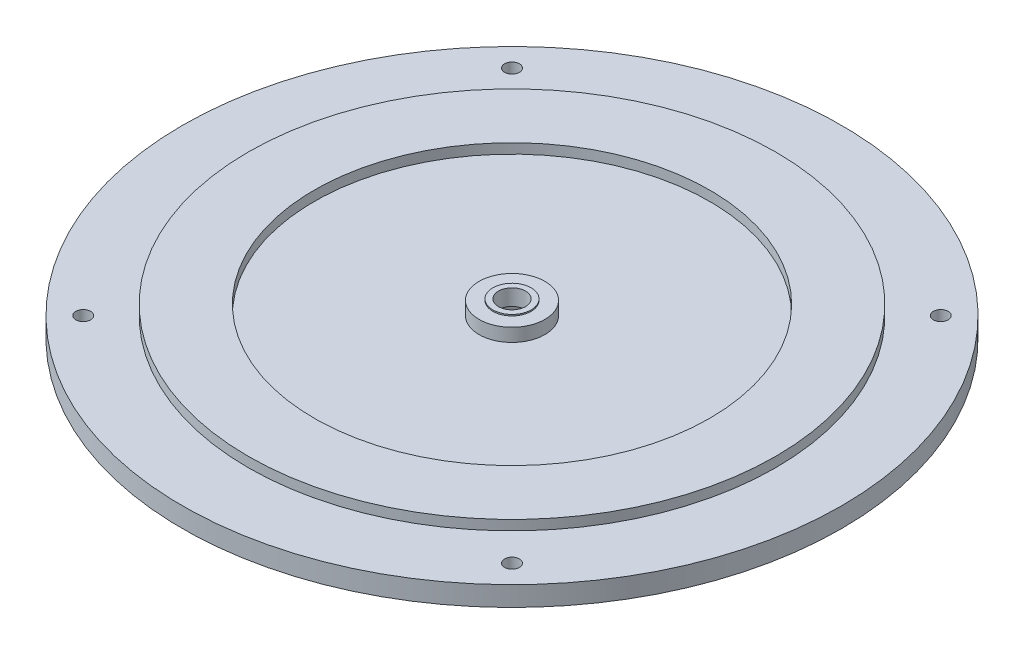
ISO-10303-21;
HEADER;
FILE_DESCRIPTION(('STEP AP214'),'2;1');
FILE_NAME('part.step','',(''),(''),'','','');
FILE_SCHEMA(('AUTOMOTIVE_DESIGN { 1 0 10303 214 1 1 1 1 }'));
ENDSEC;
DATA;
#1=APPLICATION_CONTEXT('core data for automotive mechanical design processes');
#2=APPLICATION_PROTOCOL_DEFINITION('international standard','automotive_design',2000,#1);
#3=PRODUCT_CONTEXT('',#1,'mechanical');
#4=PRODUCT('Part','Part','',(#3));
#5=PRODUCT_RELATED_PRODUCT_CATEGORY('part','',(#4));
#6=PRODUCT_DEFINITION_FORMATION('','',#4);
#7=PRODUCT_DEFINITION_CONTEXT('part definition',#1,'design');
#8=PRODUCT_DEFINITION('design','',#6,#7);
#9=PRODUCT_DEFINITION_SHAPE('','',#8);
#10=(LENGTH_UNIT() NAMED_UNIT(*) SI_UNIT(.MILLI.,.METRE.));
#11=(NAMED_UNIT(*) PLANE_ANGLE_UNIT() SI_UNIT($,.RADIAN.));
#12=(NAMED_UNIT(*) SI_UNIT($,.STERADIAN.) SOLID_ANGLE_UNIT());
#13=UNCERTAINTY_MEASURE_WITH_UNIT(LENGTH_MEASURE(1.E-05),#10,'distance_accuracy_value','');
#14=(GEOMETRIC_REPRESENTATION_CONTEXT(3) GLOBAL_UNCERTAINTY_ASSIGNED_CONTEXT((#13)) GLOBAL_UNIT_ASSIGNED_CONTEXT((#10,
#11,#12)) REPRESENTATION_CONTEXT('',''));
#15=CARTESIAN_POINT('',(0.,0.,0.));
#16=DIRECTION('',(0.,0.,1.));
#17=DIRECTION('',(1.,0.,0.));
#18=AXIS2_PLACEMENT_3D('',#15,#16,#17);
#19=CARTESIAN_POINT('',(85.,-0.5,-85.));
#20=DIRECTION('',(0.,1.,0.));
#21=DIRECTION('',(0.,0.,-1.));
#22=AXIS2_PLACEMENT_3D('',#19,#20,#21);
#23=PLANE('',#22);
#24=CARTESIAN_POINT('',(85.,-0.5,-85.));
#25=DIRECTION('',(0.,1.,0.));
#26=DIRECTION('',(1.,0.,0.));
#27=AXIS2_PLACEMENT_3D('',#24,#25,#26);
#28=CIRCLE('',#27,5.8);
#29=CARTESIAN_POINT('',(90.8,-0.5,-85.));
#30=VERTEX_POINT('',#29);
#31=EDGE_CURVE('E24',#30,#30,#28,.T.);
#32=ORIENTED_EDGE('',*,*,#31,.F.);
#33=EDGE_LOOP('',(#32));
#34=FACE_BOUND('',#33,.T.);
#35=CARTESIAN_POINT('',(85.,-0.5,-85.));
#36=DIRECTION('',(0.,1.,0.));
#37=DIRECTION('',(1.,0.,0.));
#38=AXIS2_PLACEMENT_3D('',#35,#36,#37);
#39=CIRCLE('',#38,10.);
#40=CARTESIAN_POINT('',(95.,-0.5,-85.));
#41=VERTEX_POINT('',#40);
#42=EDGE_CURVE('E41',#41,#41,#39,.T.);
#43=ORIENTED_EDGE('',*,*,#42,.T.);
#44=EDGE_LOOP('',(#43));
#45=FACE_BOUND('',#44,.T.);
#46=ADVANCED_FACE('F16',(#34,#45),#23,.T.);
#47=CARTESIAN_POINT('',(85.,-0.5,-85.));
#48=DIRECTION('',(0.,-1.,0.));
#49=DIRECTION('',(1.,0.,0.));
#50=AXIS2_PLACEMENT_3D('',#47,#48,#49);
#51=CYLINDRICAL_SURFACE('',#50,5.8);
#52=ORIENTED_EDGE('',*,*,#31,.T.);
#53=DIRECTION('',(0.,1.,0.));
#54=VECTOR('',#53,1.);
#55=CARTESIAN_POINT('',(90.8,-0.5,-85.));
#56=LINE('',#55,#54);
#57=CARTESIAN_POINT('',(90.8,-0.1,-85.));
#58=VERTEX_POINT('',#57);
#59=EDGE_CURVE('E10',#30,#58,#56,.T.);
#60=ORIENTED_EDGE('',*,*,#59,.T.);
#61=CARTESIAN_POINT('',(85.,-0.1,-85.));
#62=DIRECTION('',(0.,1.,0.));
#63=DIRECTION('',(1.,0.,0.));
#64=AXIS2_PLACEMENT_3D('',#61,#62,#63);
#65=CIRCLE('',#64,5.8);
#66=EDGE_CURVE('E166',#58,#58,#65,.T.);
#67=ORIENTED_EDGE('',*,*,#66,.F.);
#68=ORIENTED_EDGE('',*,*,#59,.F.);
#69=EDGE_LOOP('',(#52,#60,#67,#68));
#70=FACE_BOUND('',#69,.T.);
#71=ADVANCED_FACE('F182',(#70),#51,.T.);
#72=CARTESIAN_POINT('',(85.,-4.5,-85.));
#73=DIRECTION('',(0.,-1.,0.));
#74=DIRECTION('',(1.,0.,0.));
#75=AXIS2_PLACEMENT_3D('',#72,#73,#74);
#76=CYLINDRICAL_SURFACE('',#75,10.);
#77=CARTESIAN_POINT('',(85.,-4.5,-85.));
#78=DIRECTION('',(0.,1.,0.));
#79=DIRECTION('',(1.,0.,0.));
#80=AXIS2_PLACEMENT_3D('',#77,#78,#79);
#81=CIRCLE('',#80,10.);
#82=CARTESIAN_POINT('',(95.,-4.5,-85.));
#83=VERTEX_POINT('',#82);
#84=EDGE_CURVE('E170',#83,#83,#81,.T.);
#85=ORIENTED_EDGE('',*,*,#84,.T.);
#86=DIRECTION('',(0.,1.,0.));
#87=VECTOR('',#86,1.);
#88=CARTESIAN_POINT('',(95.,-4.5,-85.));
#89=LINE('',#88,#87);
#90=EDGE_CURVE('E163',#83,#41,#89,.T.);
#91=ORIENTED_EDGE('',*,*,#90,.T.);
#92=ORIENTED_EDGE('',*,*,#42,.F.);
#93=ORIENTED_EDGE('',*,*,#90,.F.);
#94=EDGE_LOOP('',(#85,#91,#92,#93));
#95=FACE_BOUND('',#94,.T.);
#96=ADVANCED_FACE('F164',(#95),#76,.T.);
#97=CARTESIAN_POINT('',(85.,-0.1,-85.));
#98=DIRECTION('',(0.,1.,0.));
#99=DIRECTION('',(0.,0.,-1.));
#100=AXIS2_PLACEMENT_3D('',#97,#98,#99);
#101=PLANE('',#100);
#102=CARTESIAN_POINT('',(85.,-0.1,-85.));
#103=DIRECTION('',(0.,-1.,0.));
#104=DIRECTION('',(1.,0.,0.));
#105=AXIS2_PLACEMENT_3D('',#102,#103,#104);
#106=CIRCLE('',#105,4.1);
#107=CARTESIAN_POINT('',(89.1,-0.1,-85.));
#108=VERTEX_POINT('',#107);
#109=EDGE_CURVE('E395',#108,#108,#106,.T.);
#110=ORIENTED_EDGE('',*,*,#109,.T.);
#111=EDGE_LOOP('',(#110));
#112=FACE_BOUND('',#111,.T.);
#113=ORIENTED_EDGE('',*,*,#66,.T.);
#114=EDGE_LOOP('',(#113));
#115=FACE_BOUND('',#114,.T.);
#116=ADVANCED_FACE('F192',(#112,#115),#101,.T.);
#117=CARTESIAN_POINT('',(85.,-4.5,-85.));
#118=DIRECTION('',(0.,1.,0.));
#119=DIRECTION('',(0.,0.,-1.));
#120=AXIS2_PLACEMENT_3D('',#117,#118,#119);
#121=PLANE('',#120);
#122=ORIENTED_EDGE('',*,*,#84,.F.);
#123=EDGE_LOOP('',(#122));
#124=FACE_BOUND('',#123,.T.);
#125=CARTESIAN_POINT('',(85.,-4.5,-85.));
#126=DIRECTION('',(0.,1.,0.));
#127=DIRECTION('',(1.,0.,0.));
#128=AXIS2_PLACEMENT_3D('',#125,#126,#127);
#129=CIRCLE('',#128,60.);
#130=CARTESIAN_POINT('',(145.,-4.5,-85.));
#131=VERTEX_POINT('',#130);
#132=EDGE_CURVE('E396',#131,#131,#129,.T.);
#133=ORIENTED_EDGE('',*,*,#132,.T.);
#134=EDGE_LOOP('',(#133));
#135=FACE_BOUND('',#134,.T.);
#136=ADVANCED_FACE('F200',(#124,#135),#121,.T.);
#137=CARTESIAN_POINT('',(85.,-10.5,-85.));
#138=DIRECTION('',(0.,-1.,0.));
#139=DIRECTION('',(1.,0.,0.));
#140=AXIS2_PLACEMENT_3D('',#137,#138,#139);
#141=CYLINDRICAL_SURFACE('',#140,4.1);
#142=CARTESIAN_POINT('',(85.,-5.,-85.));
#143=DIRECTION('',(0.,-1.,0.));
#144=DIRECTION('',(1.,0.,0.));
#145=AXIS2_PLACEMENT_3D('',#142,#143,#144);
#146=CIRCLE('',#145,4.1);
#147=CARTESIAN_POINT('',(89.1,-5.,-85.));
#148=VERTEX_POINT('',#147);
#149=EDGE_CURVE('E421',#148,#148,#146,.T.);
#150=ORIENTED_EDGE('',*,*,#149,.T.);
#151=DIRECTION('',(0.,1.,0.));
#152=VECTOR('',#151,1.);
#153=CARTESIAN_POINT('',(89.1,-10.5,-85.));
#154=LINE('',#153,#152);
#155=EDGE_CURVE('E391',#148,#108,#154,.T.);
#156=ORIENTED_EDGE('',*,*,#155,.T.);
#157=ORIENTED_EDGE('',*,*,#109,.F.);
#158=ORIENTED_EDGE('',*,*,#155,.F.);
#159=EDGE_LOOP('',(#150,#156,#157,#158));
#160=FACE_BOUND('',#159,.T.);
#161=ADVANCED_FACE('F201',(#160),#141,.F.);
#162=CARTESIAN_POINT('',(85.,-4.5,-85.));
#163=DIRECTION('',(0.,-1.,0.));
#164=DIRECTION('',(1.,0.,0.));
#165=AXIS2_PLACEMENT_3D('',#162,#163,#164);
#166=CYLINDRICAL_SURFACE('',#165,60.);
#167=DIRECTION('',(0.,1.,0.));
#168=VECTOR('',#167,1.);
#169=CARTESIAN_POINT('',(145.,-4.5,-85.));
#170=LINE('',#169,#168);
#171=CARTESIAN_POINT('',(145.,-1.5,-85.));
#172=VERTEX_POINT('',#171);
#173=EDGE_CURVE('E430',#131,#172,#170,.T.);
#174=ORIENTED_EDGE('',*,*,#173,.T.);
#175=CARTESIAN_POINT('',(85.,-1.5,-85.));
#176=DIRECTION('',(0.,1.,0.));
#177=DIRECTION('',(1.,0.,0.));
#178=AXIS2_PLACEMENT_3D('',#175,#176,#177);
#179=CIRCLE('',#178,60.);
#180=EDGE_CURVE('E425',#172,#172,#179,.T.);
#181=ORIENTED_EDGE('',*,*,#180,.T.);
#182=ORIENTED_EDGE('',*,*,#173,.F.);
#183=ORIENTED_EDGE('',*,*,#132,.F.);
#184=EDGE_LOOP('',(#174,#181,#182,#183));
#185=FACE_BOUND('',#184,.T.);
#186=ADVANCED_FACE('F210',(#185),#166,.F.);
#187=CARTESIAN_POINT('',(85.,-5.,-85.));
#188=DIRECTION('',(0.,1.,0.));
#189=DIRECTION('',(0.,0.,-1.));
#190=AXIS2_PLACEMENT_3D('',#187,#188,#189);
#191=PLANE('',#190);
#192=ORIENTED_EDGE('',*,*,#149,.F.);
#193=EDGE_LOOP('',(#192));
#194=FACE_BOUND('',#193,.T.);
#195=DIRECTION('',(0.50000000000019,0.,-0.866025403784329));
#196=VECTOR('',#195,1.);
#197=CARTESIAN_POINT('',(88.810511776652,-5.,-78.4));
#198=LINE('',#197,#196);
#199=CARTESIAN_POINT('',(88.810511776652,-5.,-78.4));
#200=VERTEX_POINT('',#199);
#201=CARTESIAN_POINT('',(92.621023553303,-5.,-85.));
#202=VERTEX_POINT('',#201);
#203=EDGE_CURVE('E390',#200,#202,#198,.T.);
#204=ORIENTED_EDGE('',*,*,#203,.F.);
#205=DIRECTION('',(1.,0.,0.));
#206=VECTOR('',#205,1.);
#207=CARTESIAN_POINT('',(81.189488223348,-5.,-78.4));
#208=LINE('',#207,#206);
#209=CARTESIAN_POINT('',(81.189488223348,-5.,-78.4));
#210=VERTEX_POINT('',#209);
#211=EDGE_CURVE('E407',#210,#200,#208,.T.);
#212=ORIENTED_EDGE('',*,*,#211,.F.);
#213=DIRECTION('',(0.50000000000019,0.,0.866025403784329));
#214=VECTOR('',#213,1.);
#215=CARTESIAN_POINT('',(77.378976446697,-5.,-85.));
#216=LINE('',#215,#214);
#217=CARTESIAN_POINT('',(77.378976446697,-5.,-85.));
#218=VERTEX_POINT('',#217);
#219=EDGE_CURVE('E420',#218,#210,#216,.T.);
#220=ORIENTED_EDGE('',*,*,#219,.F.);
#221=DIRECTION('',(-0.50000000000019,0.,0.866025403784329));
#222=VECTOR('',#221,1.);
#223=CARTESIAN_POINT('',(81.189488223348,-5.,-91.6));
#224=LINE('',#223,#222);
#225=CARTESIAN_POINT('',(81.189488223348,-5.,-91.6));
#226=VERTEX_POINT('',#225);
#227=EDGE_CURVE('E411',#226,#218,#224,.T.);
#228=ORIENTED_EDGE('',*,*,#227,.F.);
#229=DIRECTION('',(-1.,0.,0.));
#230=VECTOR('',#229,1.);
#231=CARTESIAN_POINT('',(88.810511776652,-5.,-91.6));
#232=LINE('',#231,#230);
#233=CARTESIAN_POINT('',(88.810511776652,-5.,-91.6));
#234=VERTEX_POINT('',#233);
#235=EDGE_CURVE('E388',#234,#226,#232,.T.);
#236=ORIENTED_EDGE('',*,*,#235,.F.);
#237=DIRECTION('',(-0.50000000000019,0.,-0.866025403784329));
#238=VECTOR('',#237,1.);
#239=CARTESIAN_POINT('',(92.621023553303,-5.,-85.));
#240=LINE('',#239,#238);
#241=EDGE_CURVE('E377',#202,#234,#240,.T.);
#242=ORIENTED_EDGE('',*,*,#241,.F.);
#243=EDGE_LOOP('',(#204,#212,#220,#228,#236,#242));
#244=FACE_BOUND('',#243,.T.);
#245=ADVANCED_FACE('F211',(#194,#244),#191,.F.);
#246=CARTESIAN_POINT('',(85.,-1.5,-85.));
#247=DIRECTION('',(0.,1.,0.));
#248=DIRECTION('',(0.,0.,-1.));
#249=AXIS2_PLACEMENT_3D('',#246,#247,#248);
#250=PLANE('',#249);
#251=ORIENTED_EDGE('',*,*,#180,.F.);
#252=EDGE_LOOP('',(#251));
#253=FACE_BOUND('',#252,.T.);
#254=CARTESIAN_POINT('',(85.,-1.5,-85.));
#255=DIRECTION('',(0.,1.,0.));
#256=DIRECTION('',(1.,0.,0.));
#257=AXIS2_PLACEMENT_3D('',#254,#255,#256);
#258=CIRCLE('',#257,80.);
#259=CARTESIAN_POINT('',(165.,-1.5,-85.));
#260=VERTEX_POINT('',#259);
#261=EDGE_CURVE('E369',#260,#260,#258,.T.);
#262=ORIENTED_EDGE('',*,*,#261,.T.);
#263=EDGE_LOOP('',(#262));
#264=FACE_BOUND('',#263,.T.);
#265=ADVANCED_FACE('F214',(#253,#264),#250,.T.);
#266=CARTESIAN_POINT('',(77.378976446697,-10.5,-85.));
#267=DIRECTION('',(0.866025403784329,0.,-0.50000000000019));
#268=DIRECTION('',(0.,-1.,0.));
#269=AXIS2_PLACEMENT_3D('',#266,#267,#268);
#270=PLANE('',#269);
#271=DIRECTION('',(0.,1.,0.));
#272=VECTOR('',#271,1.);
#273=CARTESIAN_POINT('',(77.378976446697,-10.5,-85.));
#274=LINE('',#273,#272);
#275=CARTESIAN_POINT('',(77.378976446697,-10.5,-85.));
#276=VERTEX_POINT('',#275);
#277=EDGE_CURVE('E414',#276,#218,#274,.T.);
#278=ORIENTED_EDGE('',*,*,#277,.T.);
#279=ORIENTED_EDGE('',*,*,#219,.T.);
#280=DIRECTION('',(0.,1.,0.));
#281=VECTOR('',#280,1.);
#282=CARTESIAN_POINT('',(81.189488223348,-10.5,-78.4));
#283=LINE('',#282,#281);
#284=CARTESIAN_POINT('',(81.189488223348,-10.5,-78.4));
#285=VERTEX_POINT('',#284);
#286=EDGE_CURVE('E402',#285,#210,#283,.T.);
#287=ORIENTED_EDGE('',*,*,#286,.F.);
#288=DIRECTION('',(0.50000000000019,0.,0.866025403784329));
#289=VECTOR('',#288,1.);
#290=CARTESIAN_POINT('',(77.378976446697,-10.5,-85.));
#291=LINE('',#290,#289);
#292=EDGE_CURVE('E298',#276,#285,#291,.T.);
#293=ORIENTED_EDGE('',*,*,#292,.F.);
#294=EDGE_LOOP('',(#278,#279,#287,#293));
#295=FACE_BOUND('',#294,.T.);
#296=ADVANCED_FACE('F241',(#295),#270,.T.);
#297=CARTESIAN_POINT('',(81.189488223348,-10.5,-91.6));
#298=DIRECTION('',(0.866025403784329,0.,0.50000000000019));
#299=DIRECTION('',(0.,-1.,0.));
#300=AXIS2_PLACEMENT_3D('',#297,#298,#299);
#301=PLANE('',#300);
#302=DIRECTION('',(0.,1.,0.));
#303=VECTOR('',#302,1.);
#304=CARTESIAN_POINT('',(81.189488223348,-10.5,-91.6));
#305=LINE('',#304,#303);
#306=CARTESIAN_POINT('',(81.189488223348,-10.5,-91.6));
#307=VERTEX_POINT('',#306);
#308=EDGE_CURVE('E399',#307,#226,#305,.T.);
#309=ORIENTED_EDGE('',*,*,#308,.T.);
#310=ORIENTED_EDGE('',*,*,#227,.T.);
#311=ORIENTED_EDGE('',*,*,#277,.F.);
#312=DIRECTION('',(-0.50000000000019,0.,0.866025403784329));
#313=VECTOR('',#312,1.);
#314=CARTESIAN_POINT('',(81.189488223348,-10.5,-91.6));
#315=LINE('',#314,#313);
#316=EDGE_CURVE('E332',#307,#276,#315,.T.);
#317=ORIENTED_EDGE('',*,*,#316,.F.);
#318=EDGE_LOOP('',(#309,#310,#311,#317));
#319=FACE_BOUND('',#318,.T.);
#320=ADVANCED_FACE('F222',(#319),#301,.T.);
#321=CARTESIAN_POINT('',(81.189488223348,-10.5,-78.4));
#322=DIRECTION('',(0.,0.,-1.));
#323=DIRECTION('',(0.,-1.,0.));
#324=AXIS2_PLACEMENT_3D('',#321,#322,#323);
#325=PLANE('',#324);
#326=ORIENTED_EDGE('',*,*,#286,.T.);
#327=ORIENTED_EDGE('',*,*,#211,.T.);
#328=DIRECTION('',(0.,1.,0.));
#329=VECTOR('',#328,1.);
#330=CARTESIAN_POINT('',(88.810511776652,-10.5,-78.4));
#331=LINE('',#330,#329);
#332=CARTESIAN_POINT('',(88.810511776652,-10.5,-78.4));
#333=VERTEX_POINT('',#332);
#334=EDGE_CURVE('E295',#333,#200,#331,.T.);
#335=ORIENTED_EDGE('',*,*,#334,.F.);
#336=DIRECTION('',(1.,0.,0.));
#337=VECTOR('',#336,1.);
#338=CARTESIAN_POINT('',(81.189488223348,-10.5,-78.4));
#339=LINE('',#338,#337);
#340=EDGE_CURVE('E292',#285,#333,#339,.T.);
#341=ORIENTED_EDGE('',*,*,#340,.F.);
#342=EDGE_LOOP('',(#326,#327,#335,#341));
#343=FACE_BOUND('',#342,.T.);
#344=ADVANCED_FACE('F220',(#343),#325,.T.);
#345=CARTESIAN_POINT('',(88.810511776652,-10.5,-91.6));
#346=DIRECTION('',(0.,0.,1.));
#347=DIRECTION('',(1.,0.,0.));
#348=AXIS2_PLACEMENT_3D('',#345,#346,#347);
#349=PLANE('',#348);
#350=DIRECTION('',(0.,1.,0.));
#351=VECTOR('',#350,1.);
#352=CARTESIAN_POINT('',(88.810511776652,-10.5,-91.6));
#353=LINE('',#352,#351);
#354=CARTESIAN_POINT('',(88.810511776652,-10.5,-91.6));
#355=VERTEX_POINT('',#354);
#356=EDGE_CURVE('E382',#355,#234,#353,.T.);
#357=ORIENTED_EDGE('',*,*,#356,.T.);
#358=ORIENTED_EDGE('',*,*,#235,.T.);
#359=ORIENTED_EDGE('',*,*,#308,.F.);
#360=DIRECTION('',(-1.,0.,0.));
#361=VECTOR('',#360,1.);
#362=CARTESIAN_POINT('',(88.810511776652,-10.5,-91.6));
#363=LINE('',#362,#361);
#364=EDGE_CURVE('E336',#355,#307,#363,.T.);
#365=ORIENTED_EDGE('',*,*,#364,.F.);
#366=EDGE_LOOP('',(#357,#358,#359,#365));
#367=FACE_BOUND('',#366,.T.);
#368=ADVANCED_FACE('F219',(#367),#349,.T.);
#369=CARTESIAN_POINT('',(88.810511776652,-10.5,-78.4));
#370=DIRECTION('',(-0.866025403784329,0.,-0.50000000000019));
#371=DIRECTION('',(-0.50000000000019,0.,0.866025403784329));
#372=AXIS2_PLACEMENT_3D('',#369,#370,#371);
#373=PLANE('',#372);
#374=ORIENTED_EDGE('',*,*,#334,.T.);
#375=ORIENTED_EDGE('',*,*,#203,.T.);
#376=DIRECTION('',(0.,1.,0.));
#377=VECTOR('',#376,1.);
#378=CARTESIAN_POINT('',(92.621023553303,-10.5,-85.));
#379=LINE('',#378,#377);
#380=CARTESIAN_POINT('',(92.621023553303,-10.5,-85.));
#381=VERTEX_POINT('',#380);
#382=EDGE_CURVE('E374',#381,#202,#379,.T.);
#383=ORIENTED_EDGE('',*,*,#382,.F.);
#384=DIRECTION('',(0.50000000000019,0.,-0.866025403784329));
#385=VECTOR('',#384,1.);
#386=CARTESIAN_POINT('',(88.810511776652,-10.5,-78.4));
#387=LINE('',#386,#385);
#388=EDGE_CURVE('E297',#333,#381,#387,.T.);
#389=ORIENTED_EDGE('',*,*,#388,.F.);
#390=EDGE_LOOP('',(#374,#375,#383,#389));
#391=FACE_BOUND('',#390,.T.);
#392=ADVANCED_FACE('F223',(#391),#373,.T.);
#393=CARTESIAN_POINT('',(92.621023553303,-10.5,-85.));
#394=DIRECTION('',(-0.866025403784329,0.,0.50000000000019));
#395=DIRECTION('',(0.,1.,0.));
#396=AXIS2_PLACEMENT_3D('',#393,#394,#395);
#397=PLANE('',#396);
#398=ORIENTED_EDGE('',*,*,#382,.T.);
#399=ORIENTED_EDGE('',*,*,#241,.T.);
#400=ORIENTED_EDGE('',*,*,#356,.F.);
#401=DIRECTION('',(-0.50000000000019,0.,-0.866025403784329));
#402=VECTOR('',#401,1.);
#403=CARTESIAN_POINT('',(92.621023553303,-10.5,-85.));
#404=LINE('',#403,#402);
#405=EDGE_CURVE('E317',#381,#355,#404,.T.);
#406=ORIENTED_EDGE('',*,*,#405,.F.);
#407=EDGE_LOOP('',(#398,#399,#400,#406));
#408=FACE_BOUND('',#407,.T.);
#409=ADVANCED_FACE('F228',(#408),#397,.T.);
#410=CARTESIAN_POINT('',(150.05382386916,-10.5,-150.0538238691));
#411=DIRECTION('',(0.,-1.,0.));
#412=DIRECTION('',(0.707106781186548,0.,-0.707106781186548));
#413=AXIS2_PLACEMENT_3D('',#410,#411,#412);
#414=CYLINDRICAL_SURFACE('',#413,2.25);
#415=DIRECTION('',(0.,1.,0.));
#416=VECTOR('',#415,1.);
#417=CARTESIAN_POINT('',(151.64481412683,-10.5,-151.6448141268));
#418=LINE('',#417,#416);
#419=CARTESIAN_POINT('',(151.64481412683,-10.5,-151.6448141268));
#420=VERTEX_POINT('',#419);
#421=CARTESIAN_POINT('',(151.64481412683,-4.5,-151.6448141268));
#422=VERTEX_POINT('',#421);
#423=EDGE_CURVE('E375',#420,#422,#418,.T.);
#424=ORIENTED_EDGE('',*,*,#423,.T.);
#425=CARTESIAN_POINT('',(150.05382386916,-4.5,-150.0538238691));
#426=DIRECTION('',(0.,1.,0.));
#427=DIRECTION('',(0.707106781186548,0.,-0.707106781186548));
#428=AXIS2_PLACEMENT_3D('',#425,#426,#427);
#429=CIRCLE('',#428,2.25);
#430=EDGE_CURVE('E307',#422,#422,#429,.T.);
#431=ORIENTED_EDGE('',*,*,#430,.T.);
#432=ORIENTED_EDGE('',*,*,#423,.F.);
#433=CARTESIAN_POINT('',(150.05382386916,-10.5,-150.0538238691));
#434=DIRECTION('',(0.,1.,0.));
#435=DIRECTION('',(0.707106781186548,0.,-0.707106781186548));
#436=AXIS2_PLACEMENT_3D('',#433,#434,#435);
#437=CIRCLE('',#436,2.25);
#438=EDGE_CURVE('E355',#420,#420,#437,.T.);
#439=ORIENTED_EDGE('',*,*,#438,.F.);
#440=EDGE_LOOP('',(#424,#431,#432,#439));
#441=FACE_BOUND('',#440,.T.);
#442=ADVANCED_FACE('F233',(#441),#414,.F.);
#443=CARTESIAN_POINT('',(85.,-4.5,-85.));
#444=DIRECTION('',(0.,-1.,0.));
#445=DIRECTION('',(1.,0.,0.));
#446=AXIS2_PLACEMENT_3D('',#443,#444,#445);
#447=CYLINDRICAL_SURFACE('',#446,80.);
#448=CARTESIAN_POINT('',(85.,-4.5,-85.));
#449=DIRECTION('',(0.,1.,0.));
#450=DIRECTION('',(1.,0.,0.));
#451=AXIS2_PLACEMENT_3D('',#448,#449,#450);
#452=CIRCLE('',#451,80.);
#453=CARTESIAN_POINT('',(165.,-4.5,-85.));
#454=VERTEX_POINT('',#453);
#455=EDGE_CURVE('E303',#454,#454,#452,.T.);
#456=ORIENTED_EDGE('',*,*,#455,.T.);
#457=DIRECTION('',(0.,1.,0.));
#458=VECTOR('',#457,1.);
#459=CARTESIAN_POINT('',(165.,-4.5,-85.));
#460=LINE('',#459,#458);
#461=EDGE_CURVE('E364',#454,#260,#460,.T.);
#462=ORIENTED_EDGE('',*,*,#461,.T.);
#463=ORIENTED_EDGE('',*,*,#261,.F.);
#464=ORIENTED_EDGE('',*,*,#461,.F.);
#465=EDGE_LOOP('',(#456,#462,#463,#464));
#466=FACE_BOUND('',#465,.T.);
#467=ADVANCED_FACE('F236',(#466),#447,.T.);
#468=CARTESIAN_POINT('',(19.946176130838,-10.5,-150.0538238691));
#469=DIRECTION('',(0.,-1.,0.));
#470=DIRECTION('',(-0.707106781186548,0.,-0.707106781186548));
#471=AXIS2_PLACEMENT_3D('',#468,#469,#470);
#472=CYLINDRICAL_SURFACE('',#471,2.25);
#473=DIRECTION('',(0.,1.,0.));
#474=VECTOR('',#473,1.);
#475=CARTESIAN_POINT('',(18.355185873168,-10.5,-151.6448141268));
#476=LINE('',#475,#474);
#477=CARTESIAN_POINT('',(18.355185873168,-10.5,-151.6448141268));
#478=VERTEX_POINT('',#477);
#479=CARTESIAN_POINT('',(18.355185873168,-4.5,-151.6448141268));
#480=VERTEX_POINT('',#479);
#481=EDGE_CURVE('E362',#478,#480,#476,.T.);
#482=ORIENTED_EDGE('',*,*,#481,.T.);
#483=CARTESIAN_POINT('',(19.946176130838,-4.5,-150.0538238691));
#484=DIRECTION('',(0.,1.,0.));
#485=DIRECTION('',(-0.707106781186548,0.,-0.707106781186548));
#486=AXIS2_PLACEMENT_3D('',#483,#484,#485);
#487=CIRCLE('',#486,2.25);
#488=EDGE_CURVE('E306',#480,#480,#487,.T.);
#489=ORIENTED_EDGE('',*,*,#488,.T.);
#490=ORIENTED_EDGE('',*,*,#481,.F.);
#491=CARTESIAN_POINT('',(19.946176130838,-10.5,-150.0538238691));
#492=DIRECTION('',(0.,1.,0.));
#493=DIRECTION('',(-0.707106781186548,0.,-0.707106781186548));
#494=AXIS2_PLACEMENT_3D('',#491,#492,#493);
#495=CIRCLE('',#494,2.25);
#496=EDGE_CURVE('E335',#478,#478,#495,.T.);
#497=ORIENTED_EDGE('',*,*,#496,.F.);
#498=EDGE_LOOP('',(#482,#489,#490,#497));
#499=FACE_BOUND('',#498,.T.);
#500=ADVANCED_FACE('F244',(#499),#472,.F.);
#501=CARTESIAN_POINT('',(150.05382386916,-10.5,-19.94617613083));
#502=DIRECTION('',(0.,-1.,0.));
#503=DIRECTION('',(0.707106781186548,0.,0.707106781186548));
#504=AXIS2_PLACEMENT_3D('',#501,#502,#503);
#505=CYLINDRICAL_SURFACE('',#504,2.25);
#506=DIRECTION('',(0.,1.,0.));
#507=VECTOR('',#506,1.);
#508=CARTESIAN_POINT('',(151.64481412683,-10.5,-18.35518587316));
#509=LINE('',#508,#507);
#510=CARTESIAN_POINT('',(151.64481412683,-10.5,-18.35518587316));
#511=VERTEX_POINT('',#510);
#512=CARTESIAN_POINT('',(151.64481412683,-4.5,-18.35518587316));
#513=VERTEX_POINT('',#512);
#514=EDGE_CURVE('E357',#511,#513,#509,.T.);
#515=ORIENTED_EDGE('',*,*,#514,.T.);
#516=CARTESIAN_POINT('',(150.05382386916,-4.5,-19.94617613083));
#517=DIRECTION('',(0.,1.,0.));
#518=DIRECTION('',(0.707106781186548,0.,0.707106781186548));
#519=AXIS2_PLACEMENT_3D('',#516,#517,#518);
#520=CIRCLE('',#519,2.25);
#521=EDGE_CURVE('E315',#513,#513,#520,.T.);
#522=ORIENTED_EDGE('',*,*,#521,.T.);
#523=ORIENTED_EDGE('',*,*,#514,.F.);
#524=CARTESIAN_POINT('',(150.05382386916,-10.5,-19.94617613083));
#525=DIRECTION('',(0.,1.,0.));
#526=DIRECTION('',(0.707106781186548,0.,0.707106781186548));
#527=AXIS2_PLACEMENT_3D('',#524,#525,#526);
#528=CIRCLE('',#527,2.25);
#529=EDGE_CURVE('E322',#511,#511,#528,.T.);
#530=ORIENTED_EDGE('',*,*,#529,.F.);
#531=EDGE_LOOP('',(#515,#522,#523,#530));
#532=FACE_BOUND('',#531,.T.);
#533=ADVANCED_FACE('F247',(#532),#505,.F.);
#534=CARTESIAN_POINT('',(19.946176130838,-10.5,-19.94617613083));
#535=DIRECTION('',(0.,-1.,0.));
#536=DIRECTION('',(-0.707106781186548,0.,0.707106781186548));
#537=AXIS2_PLACEMENT_3D('',#534,#535,#536);
#538=CYLINDRICAL_SURFACE('',#537,2.25);
#539=DIRECTION('',(0.,1.,0.));
#540=VECTOR('',#539,1.);
#541=CARTESIAN_POINT('',(18.355185873168,-10.5,-18.35518587316));
#542=LINE('',#541,#540);
#543=CARTESIAN_POINT('',(18.355185873168,-10.5,-18.35518587316));
#544=VERTEX_POINT('',#543);
#545=CARTESIAN_POINT('',(18.355185873168,-4.5,-18.35518587316));
#546=VERTEX_POINT('',#545);
#547=EDGE_CURVE('E356',#544,#546,#542,.T.);
#548=ORIENTED_EDGE('',*,*,#547,.T.);
#549=CARTESIAN_POINT('',(19.946176130838,-4.5,-19.94617613083));
#550=DIRECTION('',(0.,1.,0.));
#551=DIRECTION('',(-0.707106781186548,0.,0.707106781186548));
#552=AXIS2_PLACEMENT_3D('',#549,#550,#551);
#553=CIRCLE('',#552,2.25);
#554=EDGE_CURVE('E305',#546,#546,#553,.T.);
#555=ORIENTED_EDGE('',*,*,#554,.T.);
#556=ORIENTED_EDGE('',*,*,#547,.F.);
#557=CARTESIAN_POINT('',(19.946176130838,-10.5,-19.94617613083));
#558=DIRECTION('',(0.,1.,0.));
#559=DIRECTION('',(-0.707106781186548,0.,0.707106781186548));
#560=AXIS2_PLACEMENT_3D('',#557,#558,#559);
#561=CIRCLE('',#560,2.25);
#562=EDGE_CURVE('E319',#544,#544,#561,.T.);
#563=ORIENTED_EDGE('',*,*,#562,.F.);
#564=EDGE_LOOP('',(#548,#555,#556,#563));
#565=FACE_BOUND('',#564,.T.);
#566=ADVANCED_FACE('F253',(#565),#538,.F.);
#567=CARTESIAN_POINT('',(85.,-10.5,-85.));
#568=DIRECTION('',(0.,1.,0.));
#569=DIRECTION('',(0.,0.,-1.));
#570=AXIS2_PLACEMENT_3D('',#567,#568,#569);
#571=PLANE('',#570);
#572=ORIENTED_EDGE('',*,*,#438,.T.);
#573=EDGE_LOOP('',(#572));
#574=FACE_BOUND('',#573,.T.);
#575=ORIENTED_EDGE('',*,*,#364,.T.);
#576=ORIENTED_EDGE('',*,*,#316,.T.);
#577=ORIENTED_EDGE('',*,*,#292,.T.);
#578=ORIENTED_EDGE('',*,*,#340,.T.);
#579=ORIENTED_EDGE('',*,*,#388,.T.);
#580=ORIENTED_EDGE('',*,*,#405,.T.);
#581=EDGE_LOOP('',(#575,#576,#577,#578,#579,#580));
#582=FACE_BOUND('',#581,.T.);
#583=ORIENTED_EDGE('',*,*,#496,.T.);
#584=EDGE_LOOP('',(#583));
#585=FACE_BOUND('',#584,.T.);
#586=ORIENTED_EDGE('',*,*,#529,.T.);
#587=EDGE_LOOP('',(#586));
#588=FACE_BOUND('',#587,.T.);
#589=ORIENTED_EDGE('',*,*,#562,.T.);
#590=EDGE_LOOP('',(#589));
#591=FACE_BOUND('',#590,.T.);
#592=CARTESIAN_POINT('',(85.,-10.5,-85.));
#593=DIRECTION('',(0.,1.,0.));
#594=DIRECTION('',(1.,0.,0.));
#595=AXIS2_PLACEMENT_3D('',#592,#593,#594);
#596=CIRCLE('',#595,100.);
#597=CARTESIAN_POINT('',(185.,-10.5,-85.));
#598=VERTEX_POINT('',#597);
#599=EDGE_CURVE('E282',#598,#598,#596,.T.);
#600=ORIENTED_EDGE('',*,*,#599,.F.);
#601=EDGE_LOOP('',(#600));
#602=FACE_BOUND('',#601,.T.);
#603=ADVANCED_FACE('F255',(#574,#582,#585,#588,#591,#602),#571,.F.);
#604=CARTESIAN_POINT('',(85.,-4.5,-85.));
#605=DIRECTION('',(0.,1.,0.));
#606=DIRECTION('',(0.,0.,-1.));
#607=AXIS2_PLACEMENT_3D('',#604,#605,#606);
#608=PLANE('',#607);
#609=ORIENTED_EDGE('',*,*,#430,.F.);
#610=EDGE_LOOP('',(#609));
#611=FACE_BOUND('',#610,.T.);
#612=ORIENTED_EDGE('',*,*,#455,.F.);
#613=EDGE_LOOP('',(#612));
#614=FACE_BOUND('',#613,.T.);
#615=ORIENTED_EDGE('',*,*,#488,.F.);
#616=EDGE_LOOP('',(#615));
#617=FACE_BOUND('',#616,.T.);
#618=ORIENTED_EDGE('',*,*,#521,.F.);
#619=EDGE_LOOP('',(#618));
#620=FACE_BOUND('',#619,.T.);
#621=ORIENTED_EDGE('',*,*,#554,.F.);
#622=EDGE_LOOP('',(#621));
#623=FACE_BOUND('',#622,.T.);
#624=CARTESIAN_POINT('',(85.,-4.5,-85.));
#625=DIRECTION('',(0.,1.,0.));
#626=DIRECTION('',(1.,0.,0.));
#627=AXIS2_PLACEMENT_3D('',#624,#625,#626);
#628=CIRCLE('',#627,100.);
#629=CARTESIAN_POINT('',(185.,-4.5,-85.));
#630=VERTEX_POINT('',#629);
#631=EDGE_CURVE('E284',#630,#630,#628,.T.);
#632=ORIENTED_EDGE('',*,*,#631,.T.);
#633=EDGE_LOOP('',(#632));
#634=FACE_BOUND('',#633,.T.);
#635=ADVANCED_FACE('F265',(#611,#614,#617,#620,#623,#634),#608,.T.);
#636=CARTESIAN_POINT('',(85.,-4.5,-85.));
#637=DIRECTION('',(0.,1.,0.));
#638=DIRECTION('',(1.,0.,0.));
#639=AXIS2_PLACEMENT_3D('',#636,#637,#638);
#640=CYLINDRICAL_SURFACE('',#639,100.);
#641=DIRECTION('',(0.,-1.,0.));
#642=VECTOR('',#641,1.);
#643=CARTESIAN_POINT('',(185.,-4.5,-85.));
#644=LINE('',#643,#642);
#645=EDGE_CURVE('E278',#630,#598,#644,.T.);
#646=ORIENTED_EDGE('',*,*,#645,.T.);
#647=ORIENTED_EDGE('',*,*,#599,.T.);
#648=ORIENTED_EDGE('',*,*,#645,.F.);
#649=ORIENTED_EDGE('',*,*,#631,.F.);
#650=EDGE_LOOP('',(#646,#647,#648,#649));
#651=FACE_BOUND('',#650,.T.);
#652=ADVANCED_FACE('F262',(#651),#640,.T.);
#653=CLOSED_SHELL('',(#46,#71,#96,#116,#136,#161,#186,#245,#265,#296,#320,#344,#368,#392,#409,
#442,#467,#500,#533,#566,#603,#635,#652));
#654=MANIFOLD_SOLID_BREP('B1',#653);
#655=ADVANCED_BREP_SHAPE_REPRESENTATION('',(#18,#654),#14);
#656=SHAPE_DEFINITION_REPRESENTATION(#9,#655);
ENDSEC;
END-ISO-10303-21;
